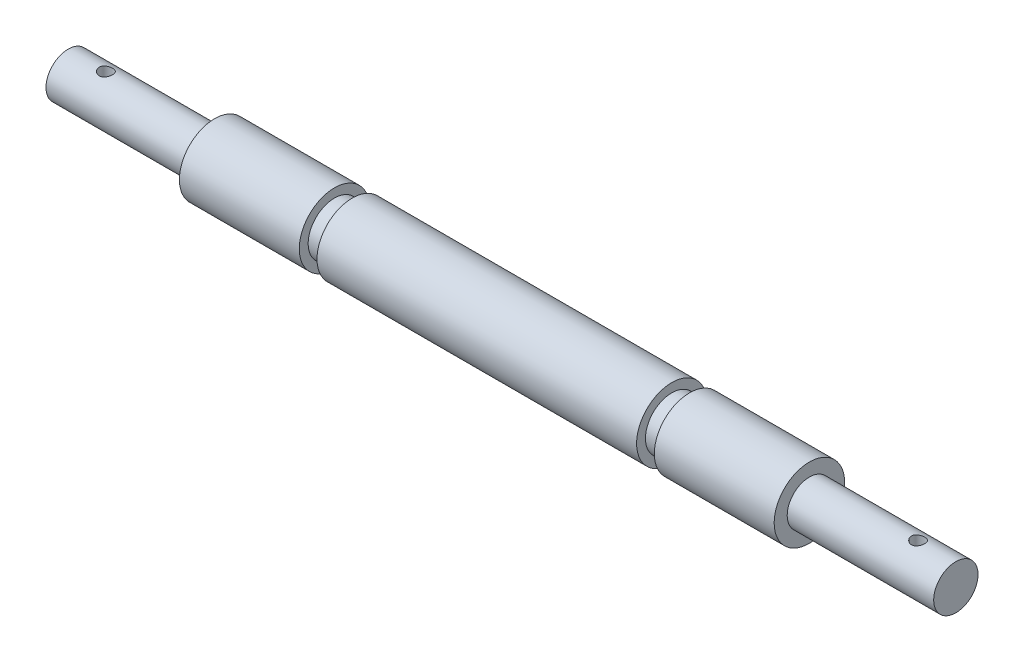
ISO-10303-21;
HEADER;
FILE_DESCRIPTION(('STEP AP214'),'2;1');
FILE_NAME('part.step','',(''),(''),'','','');
FILE_SCHEMA(('AUTOMOTIVE_DESIGN { 1 0 10303 214 1 1 1 1 }'));
ENDSEC;
DATA;
#1=APPLICATION_CONTEXT('core data for automotive mechanical design processes');
#2=APPLICATION_PROTOCOL_DEFINITION('international standard','automotive_design',2000,#1);
#3=PRODUCT_CONTEXT('',#1,'mechanical');
#4=PRODUCT('Part','Part','',(#3));
#5=PRODUCT_RELATED_PRODUCT_CATEGORY('part','',(#4));
#6=PRODUCT_DEFINITION_FORMATION('','',#4);
#7=PRODUCT_DEFINITION_CONTEXT('part definition',#1,'design');
#8=PRODUCT_DEFINITION('design','',#6,#7);
#9=PRODUCT_DEFINITION_SHAPE('','',#8);
#10=(LENGTH_UNIT() NAMED_UNIT(*) SI_UNIT(.MILLI.,.METRE.));
#11=(NAMED_UNIT(*) PLANE_ANGLE_UNIT() SI_UNIT($,.RADIAN.));
#12=(NAMED_UNIT(*) SI_UNIT($,.STERADIAN.) SOLID_ANGLE_UNIT());
#13=UNCERTAINTY_MEASURE_WITH_UNIT(LENGTH_MEASURE(1.E-05),#10,'distance_accuracy_value','');
#14=(GEOMETRIC_REPRESENTATION_CONTEXT(3) GLOBAL_UNCERTAINTY_ASSIGNED_CONTEXT((#13)) GLOBAL_UNIT_ASSIGNED_CONTEXT((#10,
#11,#12)) REPRESENTATION_CONTEXT('',''));
#15=CARTESIAN_POINT('',(0.,0.,0.));
#16=DIRECTION('',(0.,0.,1.));
#17=DIRECTION('',(1.,0.,0.));
#18=AXIS2_PLACEMENT_3D('',#15,#16,#17);
#19=CARTESIAN_POINT('',(-100.,0.,0.));
#20=DIRECTION('',(-1.,0.,0.));
#21=DIRECTION('',(0.,0.,1.));
#22=AXIS2_PLACEMENT_3D('',#19,#20,#21);
#23=CYLINDRICAL_SURFACE('',#22,5.00000000000001);
#24=CARTESIAN_POINT('',(91.5,4.76969600708472,1.5));
#25=CARTESIAN_POINT('',(91.5821945479424,4.76969685726979,1.49999897633764));
#26=CARTESIAN_POINT('',(91.664399224144,4.77184390209068,1.49322108167142));
#27=CARTESIAN_POINT('',(91.8264052495919,4.78016578302899,1.46635844446749));
#28=CARTESIAN_POINT('',(91.9062057865014,4.78634196493467,1.44626925573578));
#29=CARTESIAN_POINT('',(92.0610347282717,4.80196102485632,1.39352753269955));
#30=CARTESIAN_POINT('',(92.1360708296331,4.81139846703231,1.36089589394243));
#31=CARTESIAN_POINT('',(92.2796219339953,4.83246932547566,1.28406421917929));
#32=CARTESIAN_POINT('',(92.3481359586844,4.84410307041019,1.23986245137053));
#33=CARTESIAN_POINT('',(92.4788663905774,4.86866862185764,1.13964754141627));
#34=CARTESIAN_POINT('',(92.5408458979463,4.88162808311635,1.08333207175806));
#35=CARTESIAN_POINT('',(92.6546379513225,4.90714861936756,0.961136237579597));
#36=CARTESIAN_POINT('',(92.7064491904499,4.91970964297704,0.895254645461112));
#37=CARTESIAN_POINT('',(92.7994626998333,4.94333214579388,0.754111437793693));
#38=CARTESIAN_POINT('',(92.8404234244428,4.95435724342403,0.678684021335817));
#39=CARTESIAN_POINT('',(92.9089872590428,4.97334435920683,0.521624645369357));
#40=CARTESIAN_POINT('',(92.9365932498575,4.98130703789494,0.439994028387915));
#41=CARTESIAN_POINT('',(92.9768800010905,4.99307646003588,0.275323852630834));
#42=CARTESIAN_POINT('',(92.9899651276527,4.99699557369337,0.192391398953806));
#43=CARTESIAN_POINT('',(93.0021173246464,5.00063201501347,0.0254218237493213));
#44=CARTESIAN_POINT('',(93.001187339402,5.00035022521078,-0.0586150620503608));
#45=CARTESIAN_POINT('',(92.985607131457,4.99569603817658,-0.222571156600151));
#46=CARTESIAN_POINT('',(92.9713948061901,4.99145420205259,-0.302536267641332));
#47=CARTESIAN_POINT('',(92.9303686640057,4.97951522112592,-0.458889213442518));
#48=CARTESIAN_POINT('',(92.9035540490573,4.97181785750585,-0.535276821322838));
#49=CARTESIAN_POINT('',(92.8377879765815,4.95365220986962,-0.683347326351274));
#50=CARTESIAN_POINT('',(92.7986987971927,4.94315269676705,-0.75496506469447));
#51=CARTESIAN_POINT('',(92.7096021475718,4.92049640648068,-0.890764673783147));
#52=CARTESIAN_POINT('',(92.6595920870365,4.90833923637777,-0.954944774872122));
#53=CARTESIAN_POINT('',(92.5478022492484,4.88311550488165,-1.07666048152979));
#54=CARTESIAN_POINT('',(92.4856430809703,4.8700319532146,-1.13384458040111));
#55=CARTESIAN_POINT('',(92.3524899821099,4.84483979887496,-1.23707651539823));
#56=CARTESIAN_POINT('',(92.2814951746108,4.83273129317019,-1.28312324482852));
#57=CARTESIAN_POINT('',(92.131760530751,4.81077903197677,-1.3631399533545));
#58=CARTESIAN_POINT('',(92.0529529541371,4.80095810695956,-1.39698989237679));
#59=CARTESIAN_POINT('',(91.8903927915544,4.78496392548435,-1.45083362878413));
#60=CARTESIAN_POINT('',(91.8066418284654,4.77878947915829,-1.4708319464056));
#61=CARTESIAN_POINT('',(91.6399176392607,4.77104849541241,-1.49574770282165));
#62=CARTESIAN_POINT('',(91.557031776106,4.7693187867044,-1.50119946380212));
#63=CARTESIAN_POINT('',(91.3915270999902,4.77021192441923,-1.49835947233062));
#64=CARTESIAN_POINT('',(91.3089082512692,4.77283416156588,-1.4900696437133));
#65=CARTESIAN_POINT('',(91.1485116220291,4.78197558554911,-1.4604576357419));
#66=CARTESIAN_POINT('',(91.0706638357365,4.78839176507488,-1.4394796143128));
#67=CARTESIAN_POINT('',(90.9195983091851,4.80429141231227,-1.3854857774794));
#68=CARTESIAN_POINT('',(90.8463812858594,4.81377535359072,-1.3524681034276));
#69=CARTESIAN_POINT('',(90.7044825359279,4.83505835023046,-1.274318711965));
#70=CARTESIAN_POINT('',(90.6359752790142,4.84691271069798,-1.22888564172729));
#71=CARTESIAN_POINT('',(90.5073618938192,4.87148205646986,-1.12755301600385));
#72=CARTESIAN_POINT('',(90.4472577823872,4.88419724730002,-1.07165095534897));
#73=CARTESIAN_POINT('',(90.3348195941853,4.90963633548157,-0.948455132493608));
#74=CARTESIAN_POINT('',(90.282864371013,4.92234245063003,-0.880811065857448));
#75=CARTESIAN_POINT('',(90.1910332989723,4.94584851748649,-0.737461784590265));
#76=CARTESIAN_POINT('',(90.1511568502186,4.95664856384716,-0.661756970543957));
#77=CARTESIAN_POINT('',(90.0849999694317,4.97505970474956,-0.504935504705232));
#78=CARTESIAN_POINT('',(90.058617983841,4.98269453424965,-0.42386462203785));
#79=CARTESIAN_POINT('',(90.0199390811096,4.99401979596826,-0.258169966504598));
#80=CARTESIAN_POINT('',(90.0076381340516,4.99771135670879,-0.17354721735477));
#81=CARTESIAN_POINT('',(89.9977769559455,5.00066544081398,-0.00665215388274825));
#82=CARTESIAN_POINT('',(89.9996673045922,5.00009305111321,0.0755851790862008));
#83=CARTESIAN_POINT('',(90.0168216324991,4.99497264465036,0.238519481164397));
#84=CARTESIAN_POINT('',(90.0320848534805,4.99042485330462,0.319216537346522));
#85=CARTESIAN_POINT('',(90.0752116613996,4.97791168358326,0.475935813041352));
#86=CARTESIAN_POINT('',(90.102938180649,4.96998352900865,0.551998927351386));
#87=CARTESIAN_POINT('',(90.1700819145072,4.95152943039449,0.698433237752048));
#88=CARTESIAN_POINT('',(90.2095010502862,4.94100305949945,0.768803496050574));
#89=CARTESIAN_POINT('',(90.30037345743,4.91803965828227,0.90430189242056));
#90=CARTESIAN_POINT('',(90.3521714300008,4.90555226923558,0.969190250076766));
#91=CARTESIAN_POINT('',(90.4657103883328,4.88023537212333,1.08953757134594));
#92=CARTESIAN_POINT('',(90.5274542378982,4.86740576641078,1.14499380960193));
#93=CARTESIAN_POINT('',(90.6613407783105,4.84240680631318,1.24656269394548));
#94=CARTESIAN_POINT('',(90.7337385533904,4.83026852693485,1.29234759757955));
#95=CARTESIAN_POINT('',(90.885555174161,4.80852547508792,1.37104313528775));
#96=CARTESIAN_POINT('',(90.9649706236012,4.79891948596955,1.40395995557288));
#97=CARTESIAN_POINT('',(91.1197404316063,4.78427816717594,1.45301942532949));
#98=CARTESIAN_POINT('',(91.194608646931,4.77886154840519,1.47058859011231));
#99=CARTESIAN_POINT('',(91.3463152224958,4.77157042597166,1.49407818835144));
#100=CARTESIAN_POINT('',(91.4231531846452,4.7696952122143,1.50000095706095));
#101=CARTESIAN_POINT('',(91.5,4.76969600708472,1.5));
#102=B_SPLINE_CURVE_WITH_KNOTS('',3,(#24,#25,#26,#27,#28,#29,#30,#31,#32,#33,#34,#35,#36,#37,
#38,#39,#40,#41,#42,#43,#44,#45,#46,#47,#48,#49,#50,#51,#52,#53,#54,#55,#56,#57,#58,#59,#60,#61,
#62,#63,#64,#65,#66,#67,#68,#69,#70,#71,#72,#73,#74,#75,#76,#77,#78,#79,#80,#81,#82,#83,#84,#85,
#86,#87,#88,#89,#90,#91,#92,#93,#94,#95,#96,#97,#98,#99,#100,#101),.UNSPECIFIED.,.T.,.F.,(4,2,2,
2,2,2,2,2,2,2,2,2,2,2,2,2,2,2,2,2,2,2,2,2,2,2,2,2,2,2,2,2,2,2,2,2,2,2,4),(0.,0.246300165915535,
0.492682641688993,0.738656414466191,0.984667025370097,1.23773150007983,1.49082847871273,
1.74915939273644,2.00743455587876,2.25832140149557,2.50915554101439,2.75200125990879,
2.99486235890375,3.24055209335675,3.48630016590829,3.74152147023277,3.99676812491862,
4.25446238246266,4.5120725062841,4.76008080790306,5.00805439107386,5.24958594938816,
5.49115481045787,5.73920731809387,5.9873192592892,6.24479506100599,6.50225807324199,
6.75775391814322,7.0131766232168,7.25876303911218,7.50433553047752,7.74727096872217,
7.99024634491376,8.24099627054486,8.49181852629888,8.75011639669144,9.00828993963941,
9.23861153857444,9.46888695033558),.UNSPECIFIED.);
#103=CARTESIAN_POINT('',(91.5,4.76969600708472,1.5));
#104=VERTEX_POINT('',#103);
#105=EDGE_CURVE('E138',#104,#104,#102,.T.);
#106=ORIENTED_EDGE('',*,*,#105,.F.);
#107=EDGE_LOOP('',(#106));
#108=FACE_BOUND('',#107,.T.);
#109=CARTESIAN_POINT('',(67.,0.,0.));
#110=DIRECTION('',(-1.,0.,0.));
#111=DIRECTION('',(0.,0.,1.));
#112=AXIS2_PLACEMENT_3D('',#109,#110,#111);
#113=CIRCLE('',#112,5.00000000000001);
#114=CARTESIAN_POINT('',(67.,0.,5.00000000000001));
#115=VERTEX_POINT('',#114);
#116=EDGE_CURVE('E141',#115,#115,#113,.T.);
#117=ORIENTED_EDGE('',*,*,#116,.F.);
#118=EDGE_LOOP('',(#117));
#119=FACE_BOUND('',#118,.T.);
#120=CARTESIAN_POINT('',(100.,0.,0.));
#121=DIRECTION('',(-1.,0.,0.));
#122=DIRECTION('',(0.,0.,1.));
#123=AXIS2_PLACEMENT_3D('',#120,#121,#122);
#124=CIRCLE('',#123,5.);
#125=CARTESIAN_POINT('',(100.,0.,5.));
#126=VERTEX_POINT('',#125);
#127=EDGE_CURVE('E10',#126,#126,#124,.T.);
#128=ORIENTED_EDGE('',*,*,#127,.T.);
#129=EDGE_LOOP('',(#128));
#130=FACE_BOUND('',#129,.T.);
#131=CARTESIAN_POINT('',(91.5,-4.76969600708475,1.5));
#132=CARTESIAN_POINT('',(91.4178054520576,-4.76969685726982,1.49999897633764));
#133=CARTESIAN_POINT('',(91.335600775856,-4.77184390209071,1.49322108167142));
#134=CARTESIAN_POINT('',(91.1735947504081,-4.78016578302902,1.46635844446749));
#135=CARTESIAN_POINT('',(91.0937942134985,-4.7863419649347,1.44626925573578));
#136=CARTESIAN_POINT('',(90.9389652717283,-4.80196102485635,1.39352753269955));
#137=CARTESIAN_POINT('',(90.8639291703669,-4.81139846703234,1.36089589394243));
#138=CARTESIAN_POINT('',(90.7203780660047,-4.83246932547569,1.28406421917929));
#139=CARTESIAN_POINT('',(90.6518640413156,-4.84410307041022,1.23986245137053));
#140=CARTESIAN_POINT('',(90.5211336094226,-4.86866862185768,1.13964754141627));
#141=CARTESIAN_POINT('',(90.4591541020537,-4.88162808311638,1.08333207175806));
#142=CARTESIAN_POINT('',(90.3453620486775,-4.90714861936759,0.961136237579597));
#143=CARTESIAN_POINT('',(90.2935508095501,-4.91970964297707,0.895254645461112));
#144=CARTESIAN_POINT('',(90.2005373001667,-4.94333214579391,0.754111437793693));
#145=CARTESIAN_POINT('',(90.1595765755572,-4.95435724342406,0.678684021335817));
#146=CARTESIAN_POINT('',(90.0910127409572,-4.97334435920687,0.521624645369357));
#147=CARTESIAN_POINT('',(90.0634067501425,-4.98130703789498,0.439994028387915));
#148=CARTESIAN_POINT('',(90.0231199989095,-4.99307646003591,0.275323852630834));
#149=CARTESIAN_POINT('',(90.0100348723473,-4.99699557369341,0.192391398953806));
#150=CARTESIAN_POINT('',(89.9978826753536,-5.0006320150135,0.0254218237493213));
#151=CARTESIAN_POINT('',(89.998812660598,-5.00035022521081,-0.0586150620503609));
#152=CARTESIAN_POINT('',(90.014392868543,-4.99569603817661,-0.222571156600151));
#153=CARTESIAN_POINT('',(90.0286051938099,-4.99145420205263,-0.302536267641331));
#154=CARTESIAN_POINT('',(90.0696313359943,-4.97951522112595,-0.458889213442518));
#155=CARTESIAN_POINT('',(90.0964459509427,-4.97181785750588,-0.535276821322839));
#156=CARTESIAN_POINT('',(90.1622120234185,-4.95365220986965,-0.683347326351272));
#157=CARTESIAN_POINT('',(90.2013012028073,-4.94315269676708,-0.754965064694465));
#158=CARTESIAN_POINT('',(90.2903978524282,-4.92049640648072,-0.890764673783142));
#159=CARTESIAN_POINT('',(90.3404079129635,-4.9083392363778,-0.954944774872119));
#160=CARTESIAN_POINT('',(90.4521977507516,-4.88311550488168,-1.07666048152979));
#161=CARTESIAN_POINT('',(90.5143569190297,-4.87003195321463,-1.13384458040111));
#162=CARTESIAN_POINT('',(90.6475100178901,-4.84483979887499,-1.23707651539824));
#163=CARTESIAN_POINT('',(90.7185048253892,-4.83273129317022,-1.28312324482852));
#164=CARTESIAN_POINT('',(90.868239469249,-4.8107790319768,-1.3631399533545));
#165=CARTESIAN_POINT('',(90.9470470458629,-4.80095810695959,-1.39698989237679));
#166=CARTESIAN_POINT('',(91.1096072084456,-4.78496392548438,-1.45083362878413));
#167=CARTESIAN_POINT('',(91.1933581715346,-4.77878947915832,-1.4708319464056));
#168=CARTESIAN_POINT('',(91.3600823607393,-4.77104849541244,-1.49574770282165));
#169=CARTESIAN_POINT('',(91.442968223894,-4.76931878670443,-1.50119946380212));
#170=CARTESIAN_POINT('',(91.6084729000098,-4.77021192441926,-1.49835947233062));
#171=CARTESIAN_POINT('',(91.6910917487308,-4.77283416156591,-1.4900696437133));
#172=CARTESIAN_POINT('',(91.8514883779709,-4.78197558554914,-1.4604576357419));
#173=CARTESIAN_POINT('',(91.9293361642635,-4.78839176507491,-1.4394796143128));
#174=CARTESIAN_POINT('',(92.0804016908149,-4.8042914123123,-1.3854857774794));
#175=CARTESIAN_POINT('',(92.1536187141406,-4.81377535359076,-1.35246810342759));
#176=CARTESIAN_POINT('',(92.2955174640721,-4.83505835023049,-1.27431871196501));
#177=CARTESIAN_POINT('',(92.3640247209858,-4.84691271069801,-1.22888564172729));
#178=CARTESIAN_POINT('',(92.4926381061808,-4.87148205646989,-1.12755301600385));
#179=CARTESIAN_POINT('',(92.5527422176128,-4.88419724730005,-1.07165095534897));
#180=CARTESIAN_POINT('',(92.6651804058147,-4.9096363354816,-0.948455132493603));
#181=CARTESIAN_POINT('',(92.717135628987,-4.92234245063006,-0.880811065857441));
#182=CARTESIAN_POINT('',(92.8089667010277,-4.94584851748653,-0.737461784590258));
#183=CARTESIAN_POINT('',(92.8488431497814,-4.95664856384719,-0.661756970543952));
#184=CARTESIAN_POINT('',(92.9150000305683,-4.97505970474959,-0.504935504705232));
#185=CARTESIAN_POINT('',(92.941382016159,-4.98269453424968,-0.42386462203785));
#186=CARTESIAN_POINT('',(92.9800609188904,-4.99401979596829,-0.258169966504598));
#187=CARTESIAN_POINT('',(92.9923618659484,-4.99771135670882,-0.17354721735477));
#188=CARTESIAN_POINT('',(93.0022230440545,-5.00066544081401,-0.00665215388274822));
#189=CARTESIAN_POINT('',(93.0003326954078,-5.00009305111324,0.0755851790862008));
#190=CARTESIAN_POINT('',(92.9831783675009,-4.99497264465039,0.238519481164397));
#191=CARTESIAN_POINT('',(92.9679151465195,-4.99042485330465,0.319216537346522));
#192=CARTESIAN_POINT('',(92.9247883386004,-4.97791168358329,0.475935813041352));
#193=CARTESIAN_POINT('',(92.897061819351,-4.96998352900868,0.551998927351386));
#194=CARTESIAN_POINT('',(92.8299180854928,-4.95152943039452,0.698433237752048));
#195=CARTESIAN_POINT('',(92.7904989497138,-4.94100305949948,0.768803496050574));
#196=CARTESIAN_POINT('',(92.69962654257,-4.9180396582823,0.90430189242056));
#197=CARTESIAN_POINT('',(92.6478285699992,-4.90555226923561,0.969190250076766));
#198=CARTESIAN_POINT('',(92.5342896116672,-4.88023537212336,1.08953757134594));
#199=CARTESIAN_POINT('',(92.4725457621018,-4.86740576641081,1.14499380960193));
#200=CARTESIAN_POINT('',(92.3386592216895,-4.84240680631321,1.24656269394548));
#201=CARTESIAN_POINT('',(92.2662614466096,-4.83026852693488,1.29234759757955));
#202=CARTESIAN_POINT('',(92.114444825839,-4.80852547508795,1.37104313528775));
#203=CARTESIAN_POINT('',(92.0350293763988,-4.79891948596958,1.40395995557288));
#204=CARTESIAN_POINT('',(91.8802595683937,-4.78427816717597,1.45301942532949));
#205=CARTESIAN_POINT('',(91.805391353069,-4.77886154840522,1.47058859011231));
#206=CARTESIAN_POINT('',(91.6536847775042,-4.77157042597169,1.49407818835144));
#207=CARTESIAN_POINT('',(91.5768468153548,-4.76969521221433,1.50000095706095));
#208=CARTESIAN_POINT('',(91.5,-4.76969600708475,1.5));
#209=B_SPLINE_CURVE_WITH_KNOTS('',3,(#131,#132,#133,#134,#135,#136,#137,#138,#139,#140,#141,
#142,#143,#144,#145,#146,#147,#148,#149,#150,#151,#152,#153,#154,#155,#156,#157,#158,#159,#160,
#161,#162,#163,#164,#165,#166,#167,#168,#169,#170,#171,#172,#173,#174,#175,#176,#177,#178,#179,
#180,#181,#182,#183,#184,#185,#186,#187,#188,#189,#190,#191,#192,#193,#194,#195,#196,#197,#198,
#199,#200,#201,#202,#203,#204,#205,#206,#207,#208),.UNSPECIFIED.,.T.,.F.,(4,2,2,2,2,2,2,2,2,2,2,
2,2,2,2,2,2,2,2,2,2,2,2,2,2,2,2,2,2,2,2,2,2,2,2,2,2,2,4),(0.,0.246300165915535,
0.492682641688993,0.738656414466191,0.984667025370097,1.23773150007983,1.49082847871273,
1.74915939273644,2.00743455587876,2.25832140149557,2.50915554101439,2.75200125990879,
2.99486235890375,3.24055209335674,3.48630016590829,3.74152147023277,3.99676812491862,
4.25446238246266,4.5120725062841,4.76008080790306,5.00805439107386,5.24958594938816,
5.49115481045787,5.73920731809386,5.98731925928921,6.24479506100601,6.50225807324199,
6.75775391814323,7.0131766232168,7.25876303911218,7.50433553047752,7.74727096872217,
7.99024634491376,8.24099627054486,8.49181852629888,8.75011639669144,9.00828993963941,
9.23861153857444,9.46888695033558),.UNSPECIFIED.);
#210=CARTESIAN_POINT('',(91.5,-4.76969600708475,1.5));
#211=VERTEX_POINT('',#210);
#212=EDGE_CURVE('E41',#211,#211,#209,.T.);
#213=ORIENTED_EDGE('',*,*,#212,.F.);
#214=EDGE_LOOP('',(#213));
#215=FACE_BOUND('',#214,.T.);
#216=ADVANCED_FACE('F37',(#108,#119,#130,#215),#23,.T.);
#217=CARTESIAN_POINT('',(100.,4.99999999999999,0.));
#218=DIRECTION('',(-1.,0.,0.));
#219=DIRECTION('',(0.,0.,1.));
#220=AXIS2_PLACEMENT_3D('',#217,#218,#219);
#221=PLANE('',#220);
#222=ORIENTED_EDGE('',*,*,#127,.F.);
#223=EDGE_LOOP('',(#222));
#224=FACE_BOUND('',#223,.T.);
#225=ADVANCED_FACE('F129',(#224),#221,.F.);
#226=CARTESIAN_POINT('',(-100.,4.99999999999999,0.));
#227=DIRECTION('',(1.,0.,0.));
#228=DIRECTION('',(0.,0.,-1.));
#229=AXIS2_PLACEMENT_3D('',#226,#227,#228);
#230=PLANE('',#229);
#231=CARTESIAN_POINT('',(-100.,0.,0.));
#232=DIRECTION('',(-1.,0.,0.));
#233=DIRECTION('',(0.,0.,1.));
#234=AXIS2_PLACEMENT_3D('',#231,#232,#233);
#235=CIRCLE('',#234,5.);
#236=CARTESIAN_POINT('',(-100.,0.,5.));
#237=VERTEX_POINT('',#236);
#238=EDGE_CURVE('E48',#237,#237,#235,.T.);
#239=ORIENTED_EDGE('',*,*,#238,.T.);
#240=EDGE_LOOP('',(#239));
#241=FACE_BOUND('',#240,.T.);
#242=ADVANCED_FACE('F124',(#241),#230,.F.);
#243=CARTESIAN_POINT('',(-100.,0.,0.));
#244=DIRECTION('',(-1.,0.,0.));
#245=DIRECTION('',(0.,0.,1.));
#246=AXIS2_PLACEMENT_3D('',#243,#244,#245);
#247=CYLINDRICAL_SURFACE('',#246,5.00000000000001);
#248=CARTESIAN_POINT('',(-91.5,-4.76969600708475,1.5));
#249=CARTESIAN_POINT('',(-91.4178054520576,-4.76969685726982,1.49999897633764));
#250=CARTESIAN_POINT('',(-91.335600775856,-4.77184390209071,1.49322108167142));
#251=CARTESIAN_POINT('',(-91.1735947504081,-4.78016578302902,1.46635844446749));
#252=CARTESIAN_POINT('',(-91.0937942134985,-4.7863419649347,1.44626925573578));
#253=CARTESIAN_POINT('',(-90.9389652717283,-4.80196102485635,1.39352753269955));
#254=CARTESIAN_POINT('',(-90.8639291703669,-4.81139846703234,1.36089589394243));
#255=CARTESIAN_POINT('',(-90.7203780660047,-4.83246932547569,1.28406421917929));
#256=CARTESIAN_POINT('',(-90.6518640413156,-4.84410307041022,1.23986245137053));
#257=CARTESIAN_POINT('',(-90.5211336094226,-4.86866862185768,1.13964754141627));
#258=CARTESIAN_POINT('',(-90.4591541020537,-4.88162808311638,1.08333207175806));
#259=CARTESIAN_POINT('',(-90.3453620486775,-4.90714861936759,0.961136237579597));
#260=CARTESIAN_POINT('',(-90.2935508095501,-4.91970964297707,0.895254645461112));
#261=CARTESIAN_POINT('',(-90.2005373001667,-4.94333214579391,0.754111437793693));
#262=CARTESIAN_POINT('',(-90.1595765755572,-4.95435724342406,0.678684021335817));
#263=CARTESIAN_POINT('',(-90.0910127409572,-4.97334435920687,0.521624645369357));
#264=CARTESIAN_POINT('',(-90.0634067501425,-4.98130703789498,0.439994028387915));
#265=CARTESIAN_POINT('',(-90.0231199989095,-4.99307646003591,0.275323852630834));
#266=CARTESIAN_POINT('',(-90.0100348723473,-4.99699557369341,0.192391398953806));
#267=CARTESIAN_POINT('',(-89.9978826753536,-5.0006320150135,0.0254218237493213));
#268=CARTESIAN_POINT('',(-89.998812660598,-5.00035022521081,-0.0586150620503609));
#269=CARTESIAN_POINT('',(-90.014392868543,-4.99569603817661,-0.222571156600151));
#270=CARTESIAN_POINT('',(-90.0286051938099,-4.99145420205263,-0.302536267641331));
#271=CARTESIAN_POINT('',(-90.0696313359943,-4.97951522112595,-0.458889213442518));
#272=CARTESIAN_POINT('',(-90.0964459509427,-4.97181785750588,-0.535276821322839));
#273=CARTESIAN_POINT('',(-90.1622120234185,-4.95365220986965,-0.683347326351272));
#274=CARTESIAN_POINT('',(-90.2013012028073,-4.94315269676708,-0.754965064694465));
#275=CARTESIAN_POINT('',(-90.2903978524282,-4.92049640648072,-0.890764673783142));
#276=CARTESIAN_POINT('',(-90.3404079129635,-4.9083392363778,-0.954944774872119));
#277=CARTESIAN_POINT('',(-90.4521977507516,-4.88311550488168,-1.07666048152979));
#278=CARTESIAN_POINT('',(-90.5143569190297,-4.87003195321463,-1.13384458040111));
#279=CARTESIAN_POINT('',(-90.6475100178901,-4.84483979887499,-1.23707651539824));
#280=CARTESIAN_POINT('',(-90.7185048253892,-4.83273129317022,-1.28312324482852));
#281=CARTESIAN_POINT('',(-90.868239469249,-4.8107790319768,-1.3631399533545));
#282=CARTESIAN_POINT('',(-90.9470470458629,-4.80095810695959,-1.39698989237679));
#283=CARTESIAN_POINT('',(-91.1096072084456,-4.78496392548438,-1.45083362878413));
#284=CARTESIAN_POINT('',(-91.1933581715346,-4.77878947915832,-1.4708319464056));
#285=CARTESIAN_POINT('',(-91.3600823607393,-4.77104849541244,-1.49574770282165));
#286=CARTESIAN_POINT('',(-91.442968223894,-4.76931878670443,-1.50119946380212));
#287=CARTESIAN_POINT('',(-91.6084729000098,-4.77021192441926,-1.49835947233062));
#288=CARTESIAN_POINT('',(-91.6910917487308,-4.77283416156591,-1.4900696437133));
#289=CARTESIAN_POINT('',(-91.8514883779709,-4.78197558554914,-1.4604576357419));
#290=CARTESIAN_POINT('',(-91.9293361642635,-4.78839176507491,-1.4394796143128));
#291=CARTESIAN_POINT('',(-92.0804016908149,-4.8042914123123,-1.3854857774794));
#292=CARTESIAN_POINT('',(-92.1536187141406,-4.81377535359076,-1.35246810342759));
#293=CARTESIAN_POINT('',(-92.2955174640721,-4.83505835023049,-1.27431871196501));
#294=CARTESIAN_POINT('',(-92.3640247209858,-4.84691271069801,-1.22888564172729));
#295=CARTESIAN_POINT('',(-92.4926381061808,-4.87148205646989,-1.12755301600385));
#296=CARTESIAN_POINT('',(-92.5527422176128,-4.88419724730005,-1.07165095534897));
#297=CARTESIAN_POINT('',(-92.6651804058147,-4.9096363354816,-0.948455132493603));
#298=CARTESIAN_POINT('',(-92.717135628987,-4.92234245063006,-0.880811065857441));
#299=CARTESIAN_POINT('',(-92.8089667010277,-4.94584851748653,-0.737461784590258));
#300=CARTESIAN_POINT('',(-92.8488431497814,-4.95664856384719,-0.661756970543952));
#301=CARTESIAN_POINT('',(-92.9150000305683,-4.97505970474959,-0.504935504705232));
#302=CARTESIAN_POINT('',(-92.941382016159,-4.98269453424968,-0.42386462203785));
#303=CARTESIAN_POINT('',(-92.9800609188904,-4.99401979596829,-0.258169966504598));
#304=CARTESIAN_POINT('',(-92.9923618659484,-4.99771135670882,-0.17354721735477));
#305=CARTESIAN_POINT('',(-93.0022230440545,-5.00066544081401,-0.00665215388274822));
#306=CARTESIAN_POINT('',(-93.0003326954078,-5.00009305111324,0.0755851790862008));
#307=CARTESIAN_POINT('',(-92.9831783675009,-4.99497264465039,0.238519481164397));
#308=CARTESIAN_POINT('',(-92.9679151465195,-4.99042485330465,0.319216537346522));
#309=CARTESIAN_POINT('',(-92.9247883386004,-4.97791168358329,0.475935813041352));
#310=CARTESIAN_POINT('',(-92.897061819351,-4.96998352900868,0.551998927351386));
#311=CARTESIAN_POINT('',(-92.8299180854928,-4.95152943039452,0.698433237752048));
#312=CARTESIAN_POINT('',(-92.7904989497138,-4.94100305949948,0.768803496050574));
#313=CARTESIAN_POINT('',(-92.69962654257,-4.9180396582823,0.90430189242056));
#314=CARTESIAN_POINT('',(-92.6478285699992,-4.90555226923561,0.969190250076766));
#315=CARTESIAN_POINT('',(-92.5342896116672,-4.88023537212336,1.08953757134594));
#316=CARTESIAN_POINT('',(-92.4725457621018,-4.86740576641081,1.14499380960193));
#317=CARTESIAN_POINT('',(-92.3386592216895,-4.84240680631321,1.24656269394548));
#318=CARTESIAN_POINT('',(-92.2662614466096,-4.83026852693488,1.29234759757955));
#319=CARTESIAN_POINT('',(-92.114444825839,-4.80852547508795,1.37104313528775));
#320=CARTESIAN_POINT('',(-92.0350293763988,-4.79891948596958,1.40395995557288));
#321=CARTESIAN_POINT('',(-91.8802595683937,-4.78427816717597,1.45301942532949));
#322=CARTESIAN_POINT('',(-91.805391353069,-4.77886154840522,1.47058859011231));
#323=CARTESIAN_POINT('',(-91.6536847775042,-4.77157042597169,1.49407818835144));
#324=CARTESIAN_POINT('',(-91.5768468153548,-4.76969521221433,1.50000095706095));
#325=CARTESIAN_POINT('',(-91.5,-4.76969600708475,1.5));
#326=B_SPLINE_CURVE_WITH_KNOTS('',3,(#248,#249,#250,#251,#252,#253,#254,#255,#256,#257,#258,
#259,#260,#261,#262,#263,#264,#265,#266,#267,#268,#269,#270,#271,#272,#273,#274,#275,#276,#277,
#278,#279,#280,#281,#282,#283,#284,#285,#286,#287,#288,#289,#290,#291,#292,#293,#294,#295,#296,
#297,#298,#299,#300,#301,#302,#303,#304,#305,#306,#307,#308,#309,#310,#311,#312,#313,#314,#315,
#316,#317,#318,#319,#320,#321,#322,#323,#324,#325),.UNSPECIFIED.,.T.,.F.,(4,2,2,2,2,2,2,2,2,2,2,
2,2,2,2,2,2,2,2,2,2,2,2,2,2,2,2,2,2,2,2,2,2,2,2,2,2,2,4),(0.,0.246300165915535,
0.492682641688993,0.738656414466191,0.984667025370097,1.23773150007983,1.49082847871273,
1.74915939273644,2.00743455587876,2.25832140149557,2.50915554101439,2.75200125990879,
2.99486235890375,3.24055209335674,3.48630016590829,3.74152147023277,3.99676812491862,
4.25446238246266,4.5120725062841,4.76008080790306,5.00805439107386,5.24958594938816,
5.49115481045787,5.73920731809386,5.98731925928921,6.24479506100601,6.50225807324199,
6.75775391814323,7.0131766232168,7.25876303911218,7.50433553047752,7.74727096872217,
7.99024634491376,8.24099627054486,8.49181852629888,8.75011639669144,9.00828993963941,
9.23861153857444,9.46888695033558),.UNSPECIFIED.);
#327=CARTESIAN_POINT('',(-91.5,-4.76969600708475,1.5));
#328=VERTEX_POINT('',#327);
#329=EDGE_CURVE('E64',#328,#328,#326,.T.);
#330=ORIENTED_EDGE('',*,*,#329,.T.);
#331=EDGE_LOOP('',(#330));
#332=FACE_BOUND('',#331,.T.);
#333=CARTESIAN_POINT('',(-91.5,4.76969600708472,1.5));
#334=CARTESIAN_POINT('',(-91.5821945479424,4.76969685726979,1.49999897633764));
#335=CARTESIAN_POINT('',(-91.664399224144,4.77184390209068,1.49322108167142));
#336=CARTESIAN_POINT('',(-91.8264052495919,4.78016578302899,1.46635844446749));
#337=CARTESIAN_POINT('',(-91.9062057865014,4.78634196493467,1.44626925573578));
#338=CARTESIAN_POINT('',(-92.0610347282717,4.80196102485632,1.39352753269955));
#339=CARTESIAN_POINT('',(-92.1360708296331,4.81139846703231,1.36089589394243));
#340=CARTESIAN_POINT('',(-92.2796219339953,4.83246932547566,1.28406421917929));
#341=CARTESIAN_POINT('',(-92.3481359586844,4.84410307041019,1.23986245137053));
#342=CARTESIAN_POINT('',(-92.4788663905774,4.86866862185764,1.13964754141627));
#343=CARTESIAN_POINT('',(-92.5408458979463,4.88162808311635,1.08333207175806));
#344=CARTESIAN_POINT('',(-92.6546379513225,4.90714861936756,0.961136237579597));
#345=CARTESIAN_POINT('',(-92.7064491904499,4.91970964297704,0.895254645461112));
#346=CARTESIAN_POINT('',(-92.7994626998333,4.94333214579388,0.754111437793693));
#347=CARTESIAN_POINT('',(-92.8404234244428,4.95435724342403,0.678684021335817));
#348=CARTESIAN_POINT('',(-92.9089872590428,4.97334435920683,0.521624645369357));
#349=CARTESIAN_POINT('',(-92.9365932498575,4.98130703789494,0.439994028387915));
#350=CARTESIAN_POINT('',(-92.9768800010905,4.99307646003588,0.275323852630834));
#351=CARTESIAN_POINT('',(-92.9899651276527,4.99699557369337,0.192391398953806));
#352=CARTESIAN_POINT('',(-93.0021173246464,5.00063201501347,0.0254218237493213));
#353=CARTESIAN_POINT('',(-93.001187339402,5.00035022521078,-0.0586150620503608));
#354=CARTESIAN_POINT('',(-92.985607131457,4.99569603817658,-0.222571156600151));
#355=CARTESIAN_POINT('',(-92.9713948061901,4.99145420205259,-0.302536267641332));
#356=CARTESIAN_POINT('',(-92.9303686640057,4.97951522112592,-0.458889213442518));
#357=CARTESIAN_POINT('',(-92.9035540490573,4.97181785750585,-0.535276821322838));
#358=CARTESIAN_POINT('',(-92.8377879765815,4.95365220986962,-0.683347326351274));
#359=CARTESIAN_POINT('',(-92.7986987971927,4.94315269676705,-0.75496506469447));
#360=CARTESIAN_POINT('',(-92.7096021475718,4.92049640648068,-0.890764673783147));
#361=CARTESIAN_POINT('',(-92.6595920870365,4.90833923637777,-0.954944774872122));
#362=CARTESIAN_POINT('',(-92.5478022492484,4.88311550488165,-1.07666048152979));
#363=CARTESIAN_POINT('',(-92.4856430809703,4.8700319532146,-1.13384458040111));
#364=CARTESIAN_POINT('',(-92.3524899821099,4.84483979887496,-1.23707651539823));
#365=CARTESIAN_POINT('',(-92.2814951746108,4.83273129317019,-1.28312324482852));
#366=CARTESIAN_POINT('',(-92.131760530751,4.81077903197677,-1.3631399533545));
#367=CARTESIAN_POINT('',(-92.0529529541371,4.80095810695956,-1.39698989237679));
#368=CARTESIAN_POINT('',(-91.8903927915544,4.78496392548435,-1.45083362878413));
#369=CARTESIAN_POINT('',(-91.8066418284654,4.77878947915829,-1.4708319464056));
#370=CARTESIAN_POINT('',(-91.6399176392607,4.77104849541241,-1.49574770282165));
#371=CARTESIAN_POINT('',(-91.557031776106,4.7693187867044,-1.50119946380212));
#372=CARTESIAN_POINT('',(-91.3915270999902,4.77021192441923,-1.49835947233062));
#373=CARTESIAN_POINT('',(-91.3089082512692,4.77283416156588,-1.4900696437133));
#374=CARTESIAN_POINT('',(-91.1485116220291,4.78197558554911,-1.4604576357419));
#375=CARTESIAN_POINT('',(-91.0706638357365,4.78839176507488,-1.4394796143128));
#376=CARTESIAN_POINT('',(-90.9195983091851,4.80429141231227,-1.3854857774794));
#377=CARTESIAN_POINT('',(-90.8463812858594,4.81377535359072,-1.3524681034276));
#378=CARTESIAN_POINT('',(-90.7044825359279,4.83505835023046,-1.274318711965));
#379=CARTESIAN_POINT('',(-90.6359752790142,4.84691271069798,-1.22888564172729));
#380=CARTESIAN_POINT('',(-90.5073618938192,4.87148205646986,-1.12755301600385));
#381=CARTESIAN_POINT('',(-90.4472577823872,4.88419724730002,-1.07165095534897));
#382=CARTESIAN_POINT('',(-90.3348195941853,4.90963633548157,-0.948455132493608));
#383=CARTESIAN_POINT('',(-90.282864371013,4.92234245063003,-0.880811065857448));
#384=CARTESIAN_POINT('',(-90.1910332989723,4.94584851748649,-0.737461784590265));
#385=CARTESIAN_POINT('',(-90.1511568502186,4.95664856384716,-0.661756970543957));
#386=CARTESIAN_POINT('',(-90.0849999694317,4.97505970474956,-0.504935504705232));
#387=CARTESIAN_POINT('',(-90.058617983841,4.98269453424965,-0.42386462203785));
#388=CARTESIAN_POINT('',(-90.0199390811096,4.99401979596826,-0.258169966504598));
#389=CARTESIAN_POINT('',(-90.0076381340516,4.99771135670879,-0.17354721735477));
#390=CARTESIAN_POINT('',(-89.9977769559455,5.00066544081398,-0.00665215388274825));
#391=CARTESIAN_POINT('',(-89.9996673045922,5.00009305111321,0.0755851790862008));
#392=CARTESIAN_POINT('',(-90.0168216324991,4.99497264465036,0.238519481164397));
#393=CARTESIAN_POINT('',(-90.0320848534805,4.99042485330462,0.319216537346522));
#394=CARTESIAN_POINT('',(-90.0752116613996,4.97791168358326,0.475935813041352));
#395=CARTESIAN_POINT('',(-90.102938180649,4.96998352900865,0.551998927351386));
#396=CARTESIAN_POINT('',(-90.1700819145072,4.95152943039449,0.698433237752048));
#397=CARTESIAN_POINT('',(-90.2095010502862,4.94100305949945,0.768803496050574));
#398=CARTESIAN_POINT('',(-90.30037345743,4.91803965828227,0.90430189242056));
#399=CARTESIAN_POINT('',(-90.3521714300008,4.90555226923558,0.969190250076766));
#400=CARTESIAN_POINT('',(-90.4657103883328,4.88023537212333,1.08953757134594));
#401=CARTESIAN_POINT('',(-90.5274542378982,4.86740576641078,1.14499380960193));
#402=CARTESIAN_POINT('',(-90.6613407783105,4.84240680631318,1.24656269394548));
#403=CARTESIAN_POINT('',(-90.7337385533904,4.83026852693485,1.29234759757955));
#404=CARTESIAN_POINT('',(-90.885555174161,4.80852547508792,1.37104313528775));
#405=CARTESIAN_POINT('',(-90.9649706236012,4.79891948596955,1.40395995557288));
#406=CARTESIAN_POINT('',(-91.1197404316063,4.78427816717594,1.45301942532949));
#407=CARTESIAN_POINT('',(-91.194608646931,4.77886154840519,1.47058859011231));
#408=CARTESIAN_POINT('',(-91.3463152224958,4.77157042597166,1.49407818835144));
#409=CARTESIAN_POINT('',(-91.4231531846452,4.7696952122143,1.50000095706095));
#410=CARTESIAN_POINT('',(-91.5,4.76969600708472,1.5));
#411=B_SPLINE_CURVE_WITH_KNOTS('',3,(#333,#334,#335,#336,#337,#338,#339,#340,#341,#342,#343,
#344,#345,#346,#347,#348,#349,#350,#351,#352,#353,#354,#355,#356,#357,#358,#359,#360,#361,#362,
#363,#364,#365,#366,#367,#368,#369,#370,#371,#372,#373,#374,#375,#376,#377,#378,#379,#380,#381,
#382,#383,#384,#385,#386,#387,#388,#389,#390,#391,#392,#393,#394,#395,#396,#397,#398,#399,#400,
#401,#402,#403,#404,#405,#406,#407,#408,#409,#410),.UNSPECIFIED.,.T.,.F.,(4,2,2,2,2,2,2,2,2,2,2,
2,2,2,2,2,2,2,2,2,2,2,2,2,2,2,2,2,2,2,2,2,2,2,2,2,2,2,4),(0.,0.246300165915535,
0.492682641688993,0.738656414466191,0.984667025370097,1.23773150007983,1.49082847871273,
1.74915939273644,2.00743455587876,2.25832140149557,2.50915554101439,2.75200125990879,
2.99486235890375,3.24055209335675,3.48630016590829,3.74152147023277,3.99676812491862,
4.25446238246266,4.5120725062841,4.76008080790306,5.00805439107386,5.24958594938816,
5.49115481045787,5.73920731809387,5.9873192592892,6.24479506100599,6.50225807324199,
6.75775391814322,7.0131766232168,7.25876303911218,7.50433553047752,7.74727096872217,
7.99024634491376,8.24099627054486,8.49181852629888,8.75011639669144,9.00828993963941,
9.23861153857444,9.46888695033558),.UNSPECIFIED.);
#412=CARTESIAN_POINT('',(-91.5,4.76969600708472,1.5));
#413=VERTEX_POINT('',#412);
#414=EDGE_CURVE('E57',#413,#413,#411,.T.);
#415=ORIENTED_EDGE('',*,*,#414,.T.);
#416=EDGE_LOOP('',(#415));
#417=FACE_BOUND('',#416,.T.);
#418=ORIENTED_EDGE('',*,*,#238,.F.);
#419=EDGE_LOOP('',(#418));
#420=FACE_BOUND('',#419,.T.);
#421=CARTESIAN_POINT('',(-67.,0.,0.));
#422=DIRECTION('',(-1.,0.,0.));
#423=DIRECTION('',(0.,0.,1.));
#424=AXIS2_PLACEMENT_3D('',#421,#422,#423);
#425=CIRCLE('',#424,5.00000000000001);
#426=CARTESIAN_POINT('',(-67.,0.,5.00000000000001));
#427=VERTEX_POINT('',#426);
#428=EDGE_CURVE('E53',#427,#427,#425,.T.);
#429=ORIENTED_EDGE('',*,*,#428,.T.);
#430=EDGE_LOOP('',(#429));
#431=FACE_BOUND('',#430,.T.);
#432=ADVANCED_FACE('F67',(#332,#417,#420,#431),#247,.T.);
#433=CARTESIAN_POINT('',(-67.,7.93749999999999,0.));
#434=DIRECTION('',(1.,0.,0.));
#435=DIRECTION('',(0.,0.,-1.));
#436=AXIS2_PLACEMENT_3D('',#433,#434,#435);
#437=PLANE('',#436);
#438=ORIENTED_EDGE('',*,*,#428,.F.);
#439=EDGE_LOOP('',(#438));
#440=FACE_BOUND('',#439,.T.);
#441=CARTESIAN_POINT('',(-67.,0.,0.));
#442=DIRECTION('',(-1.,0.,0.));
#443=DIRECTION('',(0.,0.,1.));
#444=AXIS2_PLACEMENT_3D('',#441,#442,#443);
#445=CIRCLE('',#444,7.93750000000001);
#446=CARTESIAN_POINT('',(-67.,0.,7.93750000000001));
#447=VERTEX_POINT('',#446);
#448=EDGE_CURVE('E262',#447,#447,#445,.T.);
#449=ORIENTED_EDGE('',*,*,#448,.T.);
#450=EDGE_LOOP('',(#449));
#451=FACE_BOUND('',#450,.T.);
#452=ADVANCED_FACE('F117',(#440,#451),#437,.F.);
#453=CARTESIAN_POINT('',(-100.,0.,0.));
#454=DIRECTION('',(-1.,0.,0.));
#455=DIRECTION('',(0.,0.,1.));
#456=AXIS2_PLACEMENT_3D('',#453,#454,#455);
#457=CYLINDRICAL_SURFACE('',#456,7.93750000000001);
#458=ORIENTED_EDGE('',*,*,#448,.F.);
#459=EDGE_LOOP('',(#458));
#460=FACE_BOUND('',#459,.T.);
#461=CARTESIAN_POINT('',(-40.,0.,0.));
#462=DIRECTION('',(-1.,0.,0.));
#463=DIRECTION('',(0.,0.,1.));
#464=AXIS2_PLACEMENT_3D('',#461,#462,#463);
#465=CIRCLE('',#464,7.93750000000001);
#466=CARTESIAN_POINT('',(-40.,0.,7.93750000000001));
#467=VERTEX_POINT('',#466);
#468=EDGE_CURVE('E264',#467,#467,#465,.T.);
#469=ORIENTED_EDGE('',*,*,#468,.T.);
#470=EDGE_LOOP('',(#469));
#471=FACE_BOUND('',#470,.T.);
#472=ADVANCED_FACE('F114',(#460,#471),#457,.T.);
#473=CARTESIAN_POINT('',(-40.,7.9375,0.));
#474=DIRECTION('',(-1.,0.,0.));
#475=DIRECTION('',(0.,0.,1.));
#476=AXIS2_PLACEMENT_3D('',#473,#474,#475);
#477=PLANE('',#476);
#478=ORIENTED_EDGE('',*,*,#468,.F.);
#479=EDGE_LOOP('',(#478));
#480=FACE_BOUND('',#479,.T.);
#481=CARTESIAN_POINT('',(-40.,0.,0.));
#482=DIRECTION('',(-1.,0.,0.));
#483=DIRECTION('',(0.,0.,1.));
#484=AXIS2_PLACEMENT_3D('',#481,#482,#483);
#485=CIRCLE('',#484,5.93750000000001);
#486=CARTESIAN_POINT('',(-40.,0.,5.93750000000001));
#487=VERTEX_POINT('',#486);
#488=EDGE_CURVE('E269',#487,#487,#485,.T.);
#489=ORIENTED_EDGE('',*,*,#488,.T.);
#490=EDGE_LOOP('',(#489));
#491=FACE_BOUND('',#490,.T.);
#492=ADVANCED_FACE('F110',(#480,#491),#477,.F.);
#493=CARTESIAN_POINT('',(-100.,0.,0.));
#494=DIRECTION('',(-1.,0.,0.));
#495=DIRECTION('',(0.,0.,1.));
#496=AXIS2_PLACEMENT_3D('',#493,#494,#495);
#497=CYLINDRICAL_SURFACE('',#496,5.93750000000001);
#498=ORIENTED_EDGE('',*,*,#488,.F.);
#499=EDGE_LOOP('',(#498));
#500=FACE_BOUND('',#499,.T.);
#501=CARTESIAN_POINT('',(-36.,0.,0.));
#502=DIRECTION('',(-1.,0.,0.));
#503=DIRECTION('',(0.,0.,1.));
#504=AXIS2_PLACEMENT_3D('',#501,#502,#503);
#505=CIRCLE('',#504,5.93750000000001);
#506=CARTESIAN_POINT('',(-36.,0.,5.93750000000001));
#507=VERTEX_POINT('',#506);
#508=EDGE_CURVE('E272',#507,#507,#505,.T.);
#509=ORIENTED_EDGE('',*,*,#508,.T.);
#510=EDGE_LOOP('',(#509));
#511=FACE_BOUND('',#510,.T.);
#512=ADVANCED_FACE('F106',(#500,#511),#497,.T.);
#513=CARTESIAN_POINT('',(-36.,7.9375,0.));
#514=DIRECTION('',(1.,0.,0.));
#515=DIRECTION('',(0.,0.,-1.));
#516=AXIS2_PLACEMENT_3D('',#513,#514,#515);
#517=PLANE('',#516);
#518=ORIENTED_EDGE('',*,*,#508,.F.);
#519=EDGE_LOOP('',(#518));
#520=FACE_BOUND('',#519,.T.);
#521=CARTESIAN_POINT('',(-36.,0.,0.));
#522=DIRECTION('',(-1.,0.,0.));
#523=DIRECTION('',(0.,0.,1.));
#524=AXIS2_PLACEMENT_3D('',#521,#522,#523);
#525=CIRCLE('',#524,7.93750000000001);
#526=CARTESIAN_POINT('',(-36.,0.,7.93750000000001));
#527=VERTEX_POINT('',#526);
#528=EDGE_CURVE('E275',#527,#527,#525,.T.);
#529=ORIENTED_EDGE('',*,*,#528,.T.);
#530=EDGE_LOOP('',(#529));
#531=FACE_BOUND('',#530,.T.);
#532=ADVANCED_FACE('F102',(#520,#531),#517,.F.);
#533=CARTESIAN_POINT('',(-100.,0.,0.));
#534=DIRECTION('',(-1.,0.,0.));
#535=DIRECTION('',(0.,0.,1.));
#536=AXIS2_PLACEMENT_3D('',#533,#534,#535);
#537=CYLINDRICAL_SURFACE('',#536,7.93750000000001);
#538=ORIENTED_EDGE('',*,*,#528,.F.);
#539=EDGE_LOOP('',(#538));
#540=FACE_BOUND('',#539,.T.);
#541=CARTESIAN_POINT('',(36.,0.,0.));
#542=DIRECTION('',(-1.,0.,0.));
#543=DIRECTION('',(0.,0.,1.));
#544=AXIS2_PLACEMENT_3D('',#541,#542,#543);
#545=CIRCLE('',#544,7.93750000000001);
#546=CARTESIAN_POINT('',(36.,0.,7.93750000000001));
#547=VERTEX_POINT('',#546);
#548=EDGE_CURVE('E278',#547,#547,#545,.T.);
#549=ORIENTED_EDGE('',*,*,#548,.T.);
#550=EDGE_LOOP('',(#549));
#551=FACE_BOUND('',#550,.T.);
#552=ADVANCED_FACE('F98',(#540,#551),#537,.T.);
#553=CARTESIAN_POINT('',(36.,7.9375,0.));
#554=DIRECTION('',(-1.,0.,0.));
#555=DIRECTION('',(0.,0.,1.));
#556=AXIS2_PLACEMENT_3D('',#553,#554,#555);
#557=PLANE('',#556);
#558=ORIENTED_EDGE('',*,*,#548,.F.);
#559=EDGE_LOOP('',(#558));
#560=FACE_BOUND('',#559,.T.);
#561=CARTESIAN_POINT('',(36.,0.,0.));
#562=DIRECTION('',(-1.,0.,0.));
#563=DIRECTION('',(0.,0.,1.));
#564=AXIS2_PLACEMENT_3D('',#561,#562,#563);
#565=CIRCLE('',#564,5.93750000000001);
#566=CARTESIAN_POINT('',(36.,0.,5.93750000000001));
#567=VERTEX_POINT('',#566);
#568=EDGE_CURVE('E281',#567,#567,#565,.T.);
#569=ORIENTED_EDGE('',*,*,#568,.T.);
#570=EDGE_LOOP('',(#569));
#571=FACE_BOUND('',#570,.T.);
#572=ADVANCED_FACE('F94',(#560,#571),#557,.F.);
#573=CARTESIAN_POINT('',(-100.,0.,0.));
#574=DIRECTION('',(-1.,0.,0.));
#575=DIRECTION('',(0.,0.,1.));
#576=AXIS2_PLACEMENT_3D('',#573,#574,#575);
#577=CYLINDRICAL_SURFACE('',#576,5.93750000000001);
#578=ORIENTED_EDGE('',*,*,#568,.F.);
#579=EDGE_LOOP('',(#578));
#580=FACE_BOUND('',#579,.T.);
#581=CARTESIAN_POINT('',(40.,0.,0.));
#582=DIRECTION('',(-1.,0.,0.));
#583=DIRECTION('',(0.,0.,1.));
#584=AXIS2_PLACEMENT_3D('',#581,#582,#583);
#585=CIRCLE('',#584,5.93750000000001);
#586=CARTESIAN_POINT('',(40.,0.,5.93750000000001));
#587=VERTEX_POINT('',#586);
#588=EDGE_CURVE('E284',#587,#587,#585,.T.);
#589=ORIENTED_EDGE('',*,*,#588,.T.);
#590=EDGE_LOOP('',(#589));
#591=FACE_BOUND('',#590,.T.);
#592=ADVANCED_FACE('F90',(#580,#591),#577,.T.);
#593=CARTESIAN_POINT('',(40.,7.9375,0.));
#594=DIRECTION('',(1.,0.,0.));
#595=DIRECTION('',(0.,0.,-1.));
#596=AXIS2_PLACEMENT_3D('',#593,#594,#595);
#597=PLANE('',#596);
#598=ORIENTED_EDGE('',*,*,#588,.F.);
#599=EDGE_LOOP('',(#598));
#600=FACE_BOUND('',#599,.T.);
#601=CARTESIAN_POINT('',(40.,0.,0.));
#602=DIRECTION('',(-1.,0.,0.));
#603=DIRECTION('',(0.,0.,1.));
#604=AXIS2_PLACEMENT_3D('',#601,#602,#603);
#605=CIRCLE('',#604,7.93750000000001);
#606=CARTESIAN_POINT('',(40.,0.,7.93750000000001));
#607=VERTEX_POINT('',#606);
#608=EDGE_CURVE('E287',#607,#607,#605,.T.);
#609=ORIENTED_EDGE('',*,*,#608,.T.);
#610=EDGE_LOOP('',(#609));
#611=FACE_BOUND('',#610,.T.);
#612=ADVANCED_FACE('F86',(#600,#611),#597,.F.);
#613=CARTESIAN_POINT('',(-100.,0.,0.));
#614=DIRECTION('',(-1.,0.,0.));
#615=DIRECTION('',(0.,0.,1.));
#616=AXIS2_PLACEMENT_3D('',#613,#614,#615);
#617=CYLINDRICAL_SURFACE('',#616,7.93750000000001);
#618=ORIENTED_EDGE('',*,*,#608,.F.);
#619=EDGE_LOOP('',(#618));
#620=FACE_BOUND('',#619,.T.);
#621=CARTESIAN_POINT('',(67.,0.,0.));
#622=DIRECTION('',(-1.,0.,0.));
#623=DIRECTION('',(0.,0.,1.));
#624=AXIS2_PLACEMENT_3D('',#621,#622,#623);
#625=CIRCLE('',#624,7.93750000000001);
#626=CARTESIAN_POINT('',(67.,0.,7.93750000000001));
#627=VERTEX_POINT('',#626);
#628=EDGE_CURVE('E290',#627,#627,#625,.T.);
#629=ORIENTED_EDGE('',*,*,#628,.T.);
#630=EDGE_LOOP('',(#629));
#631=FACE_BOUND('',#630,.T.);
#632=ADVANCED_FACE('F82',(#620,#631),#617,.T.);
#633=CARTESIAN_POINT('',(67.,7.93749999999999,0.));
#634=DIRECTION('',(-1.,0.,0.));
#635=DIRECTION('',(0.,0.,1.));
#636=AXIS2_PLACEMENT_3D('',#633,#634,#635);
#637=PLANE('',#636);
#638=ORIENTED_EDGE('',*,*,#628,.F.);
#639=EDGE_LOOP('',(#638));
#640=FACE_BOUND('',#639,.T.);
#641=ORIENTED_EDGE('',*,*,#116,.T.);
#642=EDGE_LOOP('',(#641));
#643=FACE_BOUND('',#642,.T.);
#644=ADVANCED_FACE('F76',(#640,#643),#637,.F.);
#645=CARTESIAN_POINT('',(-91.5,-7.93750000000003,0.));
#646=DIRECTION('',(0.,1.,0.));
#647=DIRECTION('',(0.,0.,1.));
#648=AXIS2_PLACEMENT_3D('',#645,#646,#647);
#649=CYLINDRICAL_SURFACE('',#648,1.5);
#650=ORIENTED_EDGE('',*,*,#414,.F.);
#651=EDGE_LOOP('',(#650));
#652=FACE_BOUND('',#651,.T.);
#653=ORIENTED_EDGE('',*,*,#329,.F.);
#654=EDGE_LOOP('',(#653));
#655=FACE_BOUND('',#654,.T.);
#656=ADVANCED_FACE('F71',(#652,#655),#649,.F.);
#657=CARTESIAN_POINT('',(91.5,-7.93750000000003,0.));
#658=DIRECTION('',(0.,1.,0.));
#659=DIRECTION('',(0.,0.,1.));
#660=AXIS2_PLACEMENT_3D('',#657,#658,#659);
#661=CYLINDRICAL_SURFACE('',#660,1.5);
#662=ORIENTED_EDGE('',*,*,#105,.T.);
#663=EDGE_LOOP('',(#662));
#664=FACE_BOUND('',#663,.T.);
#665=ORIENTED_EDGE('',*,*,#212,.T.);
#666=EDGE_LOOP('',(#665));
#667=FACE_BOUND('',#666,.T.);
#668=ADVANCED_FACE('F75',(#664,#667),#661,.F.);
#669=CLOSED_SHELL('',(#216,#225,#242,#432,#452,#472,#492,#512,#532,#552,#572,#592,#612,#632,
#644,#656,#668));
#670=MANIFOLD_SOLID_BREP('B2',#669);
#671=ADVANCED_BREP_SHAPE_REPRESENTATION('',(#18,#670),#14);
#672=SHAPE_DEFINITION_REPRESENTATION(#9,#671);
ENDSEC;
END-ISO-10303-21;
